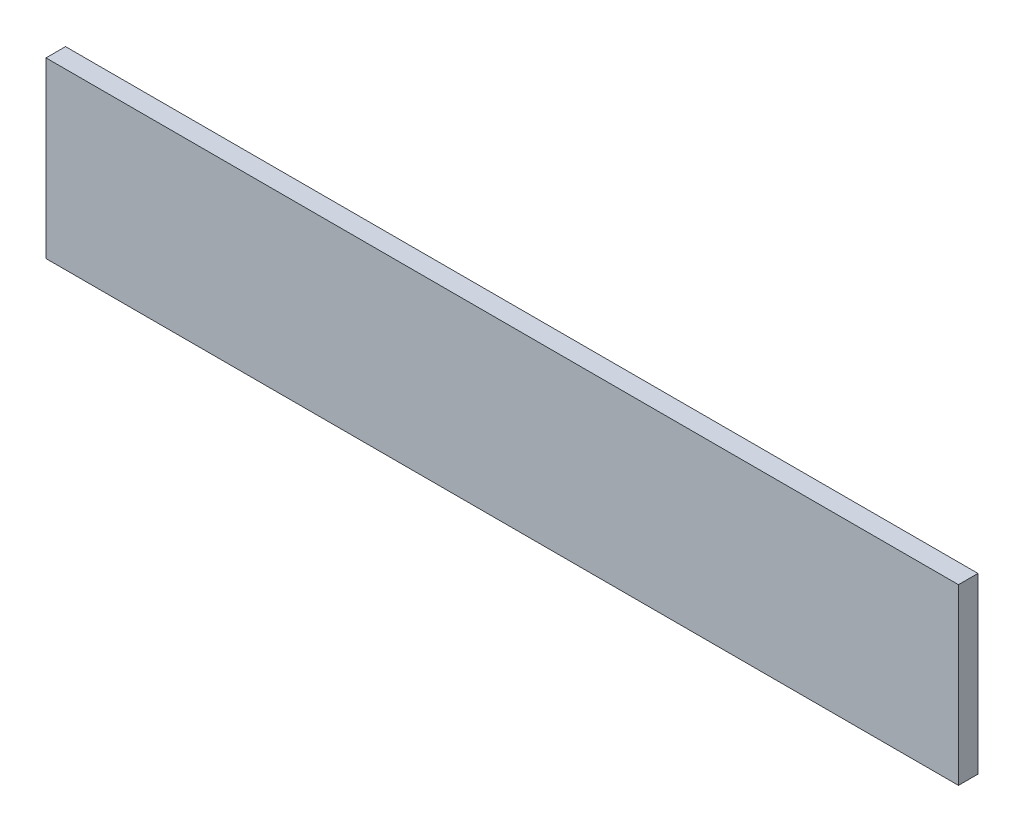
ISO-10303-21;
HEADER;
FILE_DESCRIPTION(('STEP AP214'),'2;1');
FILE_NAME('part.step','',(''),(''),'','','');
FILE_SCHEMA(('AUTOMOTIVE_DESIGN { 1 0 10303 214 1 1 1 1 }'));
ENDSEC;
DATA;
#1=APPLICATION_CONTEXT('core data for automotive mechanical design processes');
#2=APPLICATION_PROTOCOL_DEFINITION('international standard','automotive_design',2000,#1);
#3=PRODUCT_CONTEXT('',#1,'mechanical');
#4=PRODUCT('Part','Part','',(#3));
#5=PRODUCT_RELATED_PRODUCT_CATEGORY('part','',(#4));
#6=PRODUCT_DEFINITION_FORMATION('','',#4);
#7=PRODUCT_DEFINITION_CONTEXT('part definition',#1,'design');
#8=PRODUCT_DEFINITION('design','',#6,#7);
#9=PRODUCT_DEFINITION_SHAPE('','',#8);
#10=(LENGTH_UNIT() NAMED_UNIT(*) SI_UNIT(.MILLI.,.METRE.));
#11=(NAMED_UNIT(*) PLANE_ANGLE_UNIT() SI_UNIT($,.RADIAN.));
#12=(NAMED_UNIT(*) SI_UNIT($,.STERADIAN.) SOLID_ANGLE_UNIT());
#13=UNCERTAINTY_MEASURE_WITH_UNIT(LENGTH_MEASURE(1.E-05),#10,'distance_accuracy_value','');
#14=(GEOMETRIC_REPRESENTATION_CONTEXT(3) GLOBAL_UNCERTAINTY_ASSIGNED_CONTEXT((#13)) GLOBAL_UNIT_ASSIGNED_CONTEXT((#10,
#11,#12)) REPRESENTATION_CONTEXT('',''));
#15=CARTESIAN_POINT('',(0.,0.,0.));
#16=DIRECTION('',(0.,0.,1.));
#17=DIRECTION('',(1.,0.,0.));
#18=AXIS2_PLACEMENT_3D('',#15,#16,#17);
#19=CARTESIAN_POINT('',(148.415,-28.275,6.35));
#20=DIRECTION('',(-1.,0.,0.));
#21=DIRECTION('',(0.,0.,1.));
#22=AXIS2_PLACEMENT_3D('',#19,#20,#21);
#23=PLANE('',#22);
#24=DIRECTION('',(0.,1.,0.));
#25=VECTOR('',#24,1.);
#26=CARTESIAN_POINT('',(148.415,-28.275,0.));
#27=LINE('',#26,#25);
#28=CARTESIAN_POINT('',(148.415,-28.275,0.));
#29=VERTEX_POINT('',#28);
#30=CARTESIAN_POINT('',(148.415,28.275,0.));
#31=VERTEX_POINT('',#30);
#32=EDGE_CURVE('E102',#29,#31,#27,.T.);
#33=ORIENTED_EDGE('',*,*,#32,.T.);
#34=DIRECTION('',(0.,0.,-1.));
#35=VECTOR('',#34,1.);
#36=CARTESIAN_POINT('',(148.415,28.275,6.35));
#37=LINE('',#36,#35);
#38=CARTESIAN_POINT('',(148.415,28.275,6.35));
#39=VERTEX_POINT('',#38);
#40=EDGE_CURVE('E11',#39,#31,#37,.T.);
#41=ORIENTED_EDGE('',*,*,#40,.F.);
#42=DIRECTION('',(0.,1.,0.));
#43=VECTOR('',#42,1.);
#44=CARTESIAN_POINT('',(148.415,-28.275,6.35));
#45=LINE('',#44,#43);
#46=CARTESIAN_POINT('',(148.415,-28.275,6.35));
#47=VERTEX_POINT('',#46);
#48=EDGE_CURVE('E90',#47,#39,#45,.T.);
#49=ORIENTED_EDGE('',*,*,#48,.F.);
#50=DIRECTION('',(0.,0.,-1.));
#51=VECTOR('',#50,1.);
#52=CARTESIAN_POINT('',(148.415,-28.275,6.35));
#53=LINE('',#52,#51);
#54=EDGE_CURVE('E98',#47,#29,#53,.T.);
#55=ORIENTED_EDGE('',*,*,#54,.T.);
#56=EDGE_LOOP('',(#33,#41,#49,#55));
#57=FACE_BOUND('',#56,.T.);
#58=ADVANCED_FACE('F39',(#57),#23,.F.);
#59=CARTESIAN_POINT('',(-148.415,28.275,6.35));
#60=DIRECTION('',(0.,-1.,0.));
#61=DIRECTION('',(0.,0.,-1.));
#62=AXIS2_PLACEMENT_3D('',#59,#60,#61);
#63=PLANE('',#62);
#64=DIRECTION('',(-1.,0.,0.));
#65=VECTOR('',#64,1.);
#66=CARTESIAN_POINT('',(-148.415,28.275,0.));
#67=LINE('',#66,#65);
#68=CARTESIAN_POINT('',(-148.415,28.275,0.));
#69=VERTEX_POINT('',#68);
#70=EDGE_CURVE('E94',#31,#69,#67,.T.);
#71=ORIENTED_EDGE('',*,*,#70,.T.);
#72=DIRECTION('',(0.,0.,-1.));
#73=VECTOR('',#72,1.);
#74=CARTESIAN_POINT('',(-148.415,28.275,6.35));
#75=LINE('',#74,#73);
#76=CARTESIAN_POINT('',(-148.415,28.275,6.35));
#77=VERTEX_POINT('',#76);
#78=EDGE_CURVE('E47',#77,#69,#75,.T.);
#79=ORIENTED_EDGE('',*,*,#78,.F.);
#80=DIRECTION('',(-1.,0.,0.));
#81=VECTOR('',#80,1.);
#82=CARTESIAN_POINT('',(-148.415,28.275,6.35));
#83=LINE('',#82,#81);
#84=EDGE_CURVE('E85',#39,#77,#83,.T.);
#85=ORIENTED_EDGE('',*,*,#84,.F.);
#86=ORIENTED_EDGE('',*,*,#40,.T.);
#87=EDGE_LOOP('',(#71,#79,#85,#86));
#88=FACE_BOUND('',#87,.T.);
#89=ADVANCED_FACE('F93',(#88),#63,.F.);
#90=CARTESIAN_POINT('',(-148.415,-28.275,6.35));
#91=DIRECTION('',(1.,0.,0.));
#92=DIRECTION('',(0.,0.,-1.));
#93=AXIS2_PLACEMENT_3D('',#90,#91,#92);
#94=PLANE('',#93);
#95=DIRECTION('',(0.,-1.,0.));
#96=VECTOR('',#95,1.);
#97=CARTESIAN_POINT('',(-148.415,-28.275,0.));
#98=LINE('',#97,#96);
#99=CARTESIAN_POINT('',(-148.415,-28.275,0.));
#100=VERTEX_POINT('',#99);
#101=EDGE_CURVE('E72',#69,#100,#98,.T.);
#102=ORIENTED_EDGE('',*,*,#101,.T.);
#103=DIRECTION('',(0.,0.,-1.));
#104=VECTOR('',#103,1.);
#105=CARTESIAN_POINT('',(-148.415,-28.275,6.35));
#106=LINE('',#105,#104);
#107=CARTESIAN_POINT('',(-148.415,-28.275,6.35));
#108=VERTEX_POINT('',#107);
#109=EDGE_CURVE('E95',#108,#100,#106,.T.);
#110=ORIENTED_EDGE('',*,*,#109,.F.);
#111=DIRECTION('',(0.,-1.,0.));
#112=VECTOR('',#111,1.);
#113=CARTESIAN_POINT('',(-148.415,-28.275,6.35));
#114=LINE('',#113,#112);
#115=EDGE_CURVE('E88',#77,#108,#114,.T.);
#116=ORIENTED_EDGE('',*,*,#115,.F.);
#117=ORIENTED_EDGE('',*,*,#78,.T.);
#118=EDGE_LOOP('',(#102,#110,#116,#117));
#119=FACE_BOUND('',#118,.T.);
#120=ADVANCED_FACE('F96',(#119),#94,.F.);
#121=CARTESIAN_POINT('',(-148.415,-28.275,6.35));
#122=DIRECTION('',(0.,1.,0.));
#123=DIRECTION('',(0.,0.,1.));
#124=AXIS2_PLACEMENT_3D('',#121,#122,#123);
#125=PLANE('',#124);
#126=DIRECTION('',(1.,0.,0.));
#127=VECTOR('',#126,1.);
#128=CARTESIAN_POINT('',(-148.415,-28.275,0.));
#129=LINE('',#128,#127);
#130=EDGE_CURVE('E78',#100,#29,#129,.T.);
#131=ORIENTED_EDGE('',*,*,#130,.T.);
#132=ORIENTED_EDGE('',*,*,#54,.F.);
#133=DIRECTION('',(1.,0.,0.));
#134=VECTOR('',#133,1.);
#135=CARTESIAN_POINT('',(-148.415,-28.275,6.35));
#136=LINE('',#135,#134);
#137=EDGE_CURVE('E55',#108,#47,#136,.T.);
#138=ORIENTED_EDGE('',*,*,#137,.F.);
#139=ORIENTED_EDGE('',*,*,#109,.T.);
#140=EDGE_LOOP('',(#131,#132,#138,#139));
#141=FACE_BOUND('',#140,.T.);
#142=ADVANCED_FACE('F109',(#141),#125,.F.);
#143=CARTESIAN_POINT('',(0.,0.,6.35));
#144=DIRECTION('',(0.,0.,-1.));
#145=DIRECTION('',(-1.,0.,0.));
#146=AXIS2_PLACEMENT_3D('',#143,#144,#145);
#147=PLANE('',#146);
#148=ORIENTED_EDGE('',*,*,#48,.T.);
#149=ORIENTED_EDGE('',*,*,#84,.T.);
#150=ORIENTED_EDGE('',*,*,#115,.T.);
#151=ORIENTED_EDGE('',*,*,#137,.T.);
#152=EDGE_LOOP('',(#148,#149,#150,#151));
#153=FACE_BOUND('',#152,.T.);
#154=ADVANCED_FACE('F86',(#153),#147,.F.);
#155=CARTESIAN_POINT('',(0.,0.,0.));
#156=DIRECTION('',(0.,0.,-1.));
#157=DIRECTION('',(-1.,0.,0.));
#158=AXIS2_PLACEMENT_3D('',#155,#156,#157);
#159=PLANE('',#158);
#160=ORIENTED_EDGE('',*,*,#32,.F.);
#161=ORIENTED_EDGE('',*,*,#130,.F.);
#162=ORIENTED_EDGE('',*,*,#101,.F.);
#163=ORIENTED_EDGE('',*,*,#70,.F.);
#164=EDGE_LOOP('',(#160,#161,#162,#163));
#165=FACE_BOUND('',#164,.T.);
#166=ADVANCED_FACE('F112',(#165),#159,.T.);
#167=CLOSED_SHELL('',(#58,#89,#120,#142,#154,#166));
#168=MANIFOLD_SOLID_BREP('B2',#167);
#169=ADVANCED_BREP_SHAPE_REPRESENTATION('',(#18,#168),#14);
#170=SHAPE_DEFINITION_REPRESENTATION(#9,#169);
ENDSEC;
END-ISO-10303-21;
